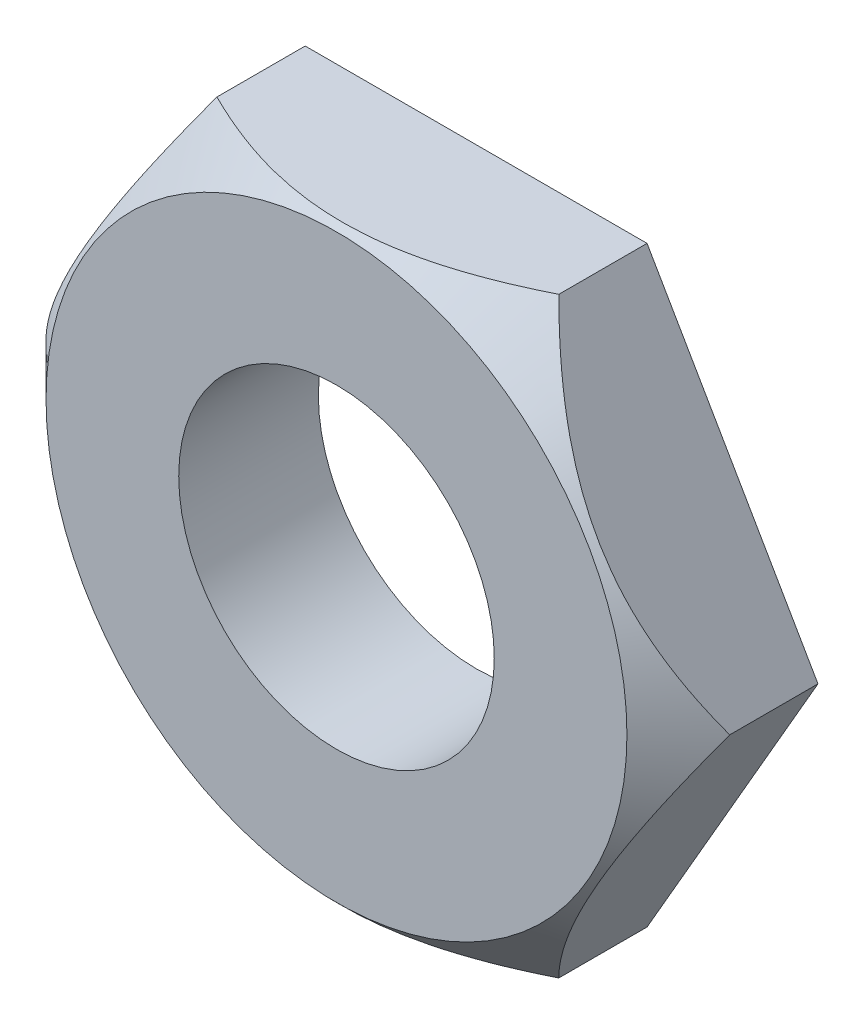
ISO-10303-21;
HEADER;
FILE_DESCRIPTION(('STEP AP214'),'2;1');
FILE_NAME('part.step','',(''),(''),'','','');
FILE_SCHEMA(('AUTOMOTIVE_DESIGN { 1 0 10303 214 1 1 1 1 }'));
ENDSEC;
DATA;
#1=APPLICATION_CONTEXT('core data for automotive mechanical design processes');
#2=APPLICATION_PROTOCOL_DEFINITION('international standard','automotive_design',2000,#1);
#3=PRODUCT_CONTEXT('',#1,'mechanical');
#4=PRODUCT('Part','Part','',(#3));
#5=PRODUCT_RELATED_PRODUCT_CATEGORY('part','',(#4));
#6=PRODUCT_DEFINITION_FORMATION('','',#4);
#7=PRODUCT_DEFINITION_CONTEXT('part definition',#1,'design');
#8=PRODUCT_DEFINITION('design','',#6,#7);
#9=PRODUCT_DEFINITION_SHAPE('','',#8);
#10=(LENGTH_UNIT() NAMED_UNIT(*) SI_UNIT(.MILLI.,.METRE.));
#11=(NAMED_UNIT(*) PLANE_ANGLE_UNIT() SI_UNIT($,.RADIAN.));
#12=(NAMED_UNIT(*) SI_UNIT($,.STERADIAN.) SOLID_ANGLE_UNIT());
#13=UNCERTAINTY_MEASURE_WITH_UNIT(LENGTH_MEASURE(1.E-05),#10,'distance_accuracy_value','');
#14=(GEOMETRIC_REPRESENTATION_CONTEXT(3) GLOBAL_UNCERTAINTY_ASSIGNED_CONTEXT((#13)) GLOBAL_UNIT_ASSIGNED_CONTEXT((#10,
#11,#12)) REPRESENTATION_CONTEXT('',''));
#15=CARTESIAN_POINT('',(0.,0.,0.));
#16=DIRECTION('',(0.,0.,1.));
#17=DIRECTION('',(1.,0.,0.));
#18=AXIS2_PLACEMENT_3D('',#15,#16,#17);
#19=CARTESIAN_POINT('',(-7.77228932383074,13.462,6.35));
#20=DIRECTION('',(0.,0.,-1.));
#21=DIRECTION('',(-1.,0.,0.));
#22=AXIS2_PLACEMENT_3D('',#19,#20,#21);
#23=PLANE('',#22);
#24=CARTESIAN_POINT('',(0.,0.,6.35));
#25=DIRECTION('',(0.,0.,1.));
#26=DIRECTION('',(1.,0.,0.));
#27=AXIS2_PLACEMENT_3D('',#24,#25,#26);
#28=CIRCLE('',#27,7.17423);
#29=CARTESIAN_POINT('',(7.17423,0.,6.35));
#30=VERTEX_POINT('',#29);
#31=EDGE_CURVE('E77',#30,#30,#28,.F.);
#32=ORIENTED_EDGE('',*,*,#31,.T.);
#33=EDGE_LOOP('',(#32));
#34=FACE_BOUND('',#33,.T.);
#35=CARTESIAN_POINT('',(0.,0.,6.34999999999998));
#36=DIRECTION('',(0.,0.,-1.));
#37=DIRECTION('',(-1.,0.,0.));
#38=AXIS2_PLACEMENT_3D('',#35,#36,#37);
#39=CIRCLE('',#38,13.208);
#40=CARTESIAN_POINT('',(-13.208,0.,6.34999999999998));
#41=VERTEX_POINT('',#40);
#42=EDGE_CURVE('E19',#41,#41,#39,.T.);
#43=ORIENTED_EDGE('',*,*,#42,.F.);
#44=EDGE_LOOP('',(#43));
#45=FACE_BOUND('',#44,.T.);
#46=ADVANCED_FACE('F16',(#34,#45),#23,.F.);
#47=CARTESIAN_POINT('',(0.,0.,3.99940188045252));
#48=DIRECTION('',(0.,0.,-1.));
#49=DIRECTION('',(-1.,0.,0.));
#50=AXIS2_PLACEMENT_3D('',#47,#48,#49);
#51=CONICAL_SURFACE('',#50,15.5585981195474,0.785398163397449);
#52=CARTESIAN_POINT('',(7.77228932383077,13.462,4.01342135233847));
#53=CARTESIAN_POINT('',(7.90590812433404,13.2305654486819,4.14701708532263));
#54=CARTESIAN_POINT('',(8.04057335250476,12.9973184314774,4.27653605164236));
#55=CARTESIAN_POINT('',(8.31215952564306,12.5269173809686,4.52612552832875));
#56=CARTESIAN_POINT('',(8.44908165378781,12.2897612983415,4.64619087895492));
#57=CARTESIAN_POINT('',(8.72599022072384,11.8101415913572,4.876086614542));
#58=CARTESIAN_POINT('',(8.8659897150954,11.5676553540717,4.98585446825292));
#59=CARTESIAN_POINT('',(9.14828803327249,11.0787003240977,5.19277128501735));
#60=CARTESIAN_POINT('',(9.29058650181399,10.8322321467446,5.28992217720917));
#61=CARTESIAN_POINT('',(9.57519502855967,10.3392757181538,5.46853139969119));
#62=CARTESIAN_POINT('',(9.71747011698533,10.0928480363492,5.55021134356942));
#63=CARTESIAN_POINT('',(10.0040146064784,9.59653842191835,5.69808514867128));
#64=CARTESIAN_POINT('',(10.1482837910951,9.34665686419564,5.76428067689693));
#65=CARTESIAN_POINT('',(10.4381994312935,8.84450824546305,5.8795192134652));
#66=CARTESIAN_POINT('',(10.5838420159958,8.59224788901308,5.92860082579886));
#67=CARTESIAN_POINT('',(10.8763497950404,8.08560955409868,6.00853309271364));
#68=CARTESIAN_POINT('',(11.0232148033916,7.83123189778038,6.03938647109106));
#69=CARTESIAN_POINT('',(11.3811201888011,7.21132158594865,6.09111971669441));
#70=CARTESIAN_POINT('',(11.592547425901,6.84511886918776,6.10197495908835));
#71=CARTESIAN_POINT('',(12.0150194354329,6.11337588390267,6.0837484129428));
#72=CARTESIAN_POINT('',(12.2260640478502,5.74783589253225,6.05465262611526));
#73=CARTESIAN_POINT('',(12.6461637644256,5.0202018391784,5.95824141710243));
#74=CARTESIAN_POINT('',(12.8552163780591,4.65811209091015,5.89088326353068));
#75=CARTESIAN_POINT('',(13.2697283588107,3.94015627990225,5.72160866026814));
#76=CARTESIAN_POINT('',(13.4751880002315,3.58428974205666,5.61969486091895));
#77=CARTESIAN_POINT('',(13.8398907049855,2.95260612776496,5.41004213758419));
#78=CARTESIAN_POINT('',(13.999941813913,2.67538947529476,5.30782014165736));
#79=CARTESIAN_POINT('',(14.317171366452,2.1259317726348,5.08690578160411));
#80=CARTESIAN_POINT('',(14.4743497232929,1.8536908727362,4.96821292090738));
#81=CARTESIAN_POINT('',(14.7853386753559,1.31504220717053,4.71701688190685));
#82=CARTESIAN_POINT('',(14.9391581147442,1.04861912295814,4.58455713846086));
#83=CARTESIAN_POINT('',(15.2439491495943,0.520705564906258,4.30756581542141));
#84=CARTESIAN_POINT('',(15.3949224217939,0.259212186871657,4.16304163417214));
#85=CARTESIAN_POINT('',(15.5445786476615,0.,4.01342135233847));
#86=B_SPLINE_CURVE_WITH_KNOTS('',3,(#52,#53,#54,#55,#56,#57,#58,#59,#60,#61,#62,#63,#64,#65,#66,
#67,#68,#69,#70,#71,#72,#73,#74,#75,#76,#77,#78,#79,#80,#81,#82,#83,#84,#85),.UNSPECIFIED.,.F.,
.F.,(4,2,2,2,2,2,2,2,2,2,2,2,2,2,2,2,4),(0.,0.896349163338948,1.79318420675432,2.69515369681333,
3.59698511261112,4.48471573633072,5.37235074581777,6.25797035663581,7.14345759818815,
8.41046117827334,9.677908812192,10.9467747215777,12.2155433337597,13.2231542983651,
14.2307956474361,15.2353491852359,16.2392911577559),.UNSPECIFIED.);
#87=CARTESIAN_POINT('',(7.77228932383075,13.462,4.01342135233848));
#88=VERTEX_POINT('',#87);
#89=CARTESIAN_POINT('',(15.5445786476615,0.,4.01342135233847));
#90=VERTEX_POINT('',#89);
#91=EDGE_CURVE('E127',#88,#90,#86,.T.);
#92=ORIENTED_EDGE('',*,*,#91,.F.);
#93=CARTESIAN_POINT('',(-7.77228932383073,13.462,4.01342135233848));
#94=CARTESIAN_POINT('',(-7.50505172282417,13.462,4.14701708532264));
#95=CARTESIAN_POINT('',(-7.23572126648274,13.462,4.27653605164237));
#96=CARTESIAN_POINT('',(-6.69254892020615,13.462,4.52612552832876));
#97=CARTESIAN_POINT('',(-6.41870466391663,13.462,4.64619087895493));
#98=CARTESIAN_POINT('',(-5.86488753004458,13.462,4.87608661454201));
#99=CARTESIAN_POINT('',(-5.58488854130146,13.462,4.98585446825293));
#100=CARTESIAN_POINT('',(-5.02029190494728,13.462,5.19277128501737));
#101=CARTESIAN_POINT('',(-4.73569496786427,13.462,5.28992217720918));
#102=CARTESIAN_POINT('',(-4.16647791437291,13.462,5.4685313996912));
#103=CARTESIAN_POINT('',(-3.88192773752159,13.462,5.55021134356943));
#104=CARTESIAN_POINT('',(-3.30883875853554,13.462,5.69808514867129));
#105=CARTESIAN_POINT('',(-3.02030038930208,13.462,5.76428067689694));
#106=CARTESIAN_POINT('',(-2.44046910890517,13.462,5.87951921346521));
#107=CARTESIAN_POINT('',(-2.14918393950064,13.462,5.92860082579887));
#108=CARTESIAN_POINT('',(-1.56416838141141,13.462,6.00853309271365));
#109=CARTESIAN_POINT('',(-1.27043836470902,13.462,6.03938647109108));
#110=CARTESIAN_POINT('',(-0.55462759389007,13.462,6.09111971669442));
#111=CARTESIAN_POINT('',(-0.131773119690327,13.462,6.10197495908836));
#112=CARTESIAN_POINT('',(0.713170899373601,13.462,6.08374841294282));
#113=CARTESIAN_POINT('',(1.13526012420818,13.462,6.05465262611527));
#114=CARTESIAN_POINT('',(1.97545955735894,13.462,5.95824141710244));
#115=CARTESIAN_POINT('',(2.3935647846259,13.462,5.8908832635307));
#116=CARTESIAN_POINT('',(3.22258874612923,13.462,5.72160866026815));
#117=CARTESIAN_POINT('',(3.63350802897069,13.462,5.61969486091896));
#118=CARTESIAN_POINT('',(4.36291343847867,13.462,5.4100421375842));
#119=CARTESIAN_POINT('',(4.68301565633371,13.462,5.30782014165738));
#120=CARTESIAN_POINT('',(5.31747476141178,13.462,5.08690578160412));
#121=CARTESIAN_POINT('',(5.63183147509355,13.462,4.96821292090739));
#122=CARTESIAN_POINT('',(6.2538093792195,13.462,4.71701688190686));
#123=CARTESIAN_POINT('',(6.56144825799621,13.462,4.58455713846087));
#124=CARTESIAN_POINT('',(7.17103032769642,13.462,4.30756581542142));
#125=CARTESIAN_POINT('',(7.47297687209559,13.462,4.16304163417215));
#126=CARTESIAN_POINT('',(7.77228932383073,13.462,4.01342135233848));
#127=B_SPLINE_CURVE_WITH_KNOTS('',3,(#93,#94,#95,#96,#97,#98,#99,#100,#101,#102,#103,#104,#105,
#106,#107,#108,#109,#110,#111,#112,#113,#114,#115,#116,#117,#118,#119,#120,#121,#122,#123,#124,
#125,#126),.UNSPECIFIED.,.F.,.F.,(4,2,2,2,2,2,2,2,2,2,2,2,2,2,2,2,4),(0.,0.89634916333895,
1.79318420675432,2.69515369681333,3.59698511261112,4.48471573633073,5.37235074581777,
6.25797035663582,7.14345759818816,8.41046117827334,9.67790881219201,10.9467747215777,
12.2155433337597,13.2231542983651,14.2307956474361,15.2353491852359,16.2392911577559),.UNSPECIFIED.);
#128=CARTESIAN_POINT('',(-7.77228932383075,13.462,4.01342135233848));
#129=VERTEX_POINT('',#128);
#130=EDGE_CURVE('E74',#129,#88,#127,.T.);
#131=ORIENTED_EDGE('',*,*,#130,.F.);
#132=CARTESIAN_POINT('',(-15.5445786476615,0.,4.01342135233848));
#133=CARTESIAN_POINT('',(-15.4109598471582,0.231434551318111,4.14701708532263));
#134=CARTESIAN_POINT('',(-15.2762946189875,0.464681568522647,4.27653605164237));
#135=CARTESIAN_POINT('',(-15.0047084458492,0.935082619031376,4.52612552832875));
#136=CARTESIAN_POINT('',(-14.8677863177044,1.17223870165855,4.64619087895492));
#137=CARTESIAN_POINT('',(-14.5908777507684,1.65185840864283,4.876086614542));
#138=CARTESIAN_POINT('',(-14.4508782563969,1.89434464592833,4.98585446825292));
#139=CARTESIAN_POINT('',(-14.1685799382198,2.3832996759023,5.19277128501736));
#140=CARTESIAN_POINT('',(-14.0262814696783,2.62976785325542,5.28992217720917));
#141=CARTESIAN_POINT('',(-13.7416729429326,3.12272428184626,5.46853139969118));
#142=CARTESIAN_POINT('',(-13.5993978545069,3.36915196365086,5.55021134356942));
#143=CARTESIAN_POINT('',(-13.3128533650139,3.86546157808166,5.69808514867128));
#144=CARTESIAN_POINT('',(-13.1685841803972,4.11534313580437,5.76428067689693));
#145=CARTESIAN_POINT('',(-12.8786685401987,4.61749175453696,5.87951921346519));
#146=CARTESIAN_POINT('',(-12.7330259554964,4.86975211098693,5.92860082579886));
#147=CARTESIAN_POINT('',(-12.4405181764518,5.37639044590133,6.00853309271364));
#148=CARTESIAN_POINT('',(-12.2936531681006,5.63076810221963,6.03938647109106));
#149=CARTESIAN_POINT('',(-11.9357477826912,6.25067841405136,6.09111971669441));
#150=CARTESIAN_POINT('',(-11.7243205455913,6.61688113081225,6.10197495908835));
#151=CARTESIAN_POINT('',(-11.3018485360593,7.34862411609734,6.0837484129428));
#152=CARTESIAN_POINT('',(-11.090803923642,7.71416410746776,6.05465262611526));
#153=CARTESIAN_POINT('',(-10.6707042070667,8.44179816082161,5.95824141710242));
#154=CARTESIAN_POINT('',(-10.4616515934332,8.80388790908986,5.89088326353068));
#155=CARTESIAN_POINT('',(-10.0471396126815,9.52184372009776,5.72160866026814));
#156=CARTESIAN_POINT('',(-9.84167997126078,9.87771025794335,5.61969486091895));
#157=CARTESIAN_POINT('',(-9.4769772665068,10.509393872235,5.41004213758418));
#158=CARTESIAN_POINT('',(-9.31692615757928,10.7866105247052,5.30782014165737));
#159=CARTESIAN_POINT('',(-8.99969660504024,11.3360682273652,5.08690578160411));
#160=CARTESIAN_POINT('',(-8.84251824819936,11.6083091272638,4.96821292090738));
#161=CARTESIAN_POINT('',(-8.53152929613638,12.1469577928295,4.71701688190685));
#162=CARTESIAN_POINT('',(-8.37770985674803,12.4133808770419,4.58455713846086));
#163=CARTESIAN_POINT('',(-8.07291882189792,12.9412944350937,4.30756581542141));
#164=CARTESIAN_POINT('',(-7.92194554969834,13.2027878131283,4.16304163417214));
#165=CARTESIAN_POINT('',(-7.77228932383077,13.462,4.01342135233847));
#166=B_SPLINE_CURVE_WITH_KNOTS('',3,(#132,#133,#134,#135,#136,#137,#138,#139,#140,#141,#142,
#143,#144,#145,#146,#147,#148,#149,#150,#151,#152,#153,#154,#155,#156,#157,#158,#159,#160,#161,
#162,#163,#164,#165),.UNSPECIFIED.,.F.,.F.,(4,2,2,2,2,2,2,2,2,2,2,2,2,2,2,2,4),(0.,
0.896349163338949,1.79318420675432,2.69515369681333,3.59698511261112,4.48471573633072,
5.37235074581776,6.2579703566358,7.14345759818814,8.41046117827333,9.677908812192,
10.9467747215777,12.2155433337597,13.2231542983651,14.2307956474361,15.2353491852359,
16.2392911577559),.UNSPECIFIED.);
#167=CARTESIAN_POINT('',(-15.5445786476615,0.,4.01342135233848));
#168=VERTEX_POINT('',#167);
#169=EDGE_CURVE('E67',#168,#129,#166,.T.);
#170=ORIENTED_EDGE('',*,*,#169,.F.);
#171=CARTESIAN_POINT('',(-7.77228932383075,-13.462,4.01342135233848));
#172=CARTESIAN_POINT('',(-7.90590812433402,-13.2305654486819,4.14701708532264));
#173=CARTESIAN_POINT('',(-8.04057335250474,-12.9973184314774,4.27653605164238));
#174=CARTESIAN_POINT('',(-8.31215952564304,-12.5269173809686,4.52612552832876));
#175=CARTESIAN_POINT('',(-8.4490816537878,-12.2897612983415,4.64619087895493));
#176=CARTESIAN_POINT('',(-8.72599022072382,-11.8101415913572,4.87608661454201));
#177=CARTESIAN_POINT('',(-8.86598971509538,-11.5676553540717,4.98585446825293));
#178=CARTESIAN_POINT('',(-9.14828803327247,-11.0787003240977,5.19277128501737));
#179=CARTESIAN_POINT('',(-9.29058650181397,-10.8322321467446,5.28992217720918));
#180=CARTESIAN_POINT('',(-9.57519502855966,-10.3392757181537,5.4685313996912));
#181=CARTESIAN_POINT('',(-9.71747011698532,-10.0928480363491,5.55021134356943));
#182=CARTESIAN_POINT('',(-10.0040146064783,-9.59653842191834,5.69808514867129));
#183=CARTESIAN_POINT('',(-10.1482837910951,-9.34665686419563,5.76428067689694));
#184=CARTESIAN_POINT('',(-10.4381994312935,-8.84450824546304,5.87951921346521));
#185=CARTESIAN_POINT('',(-10.5838420159958,-8.59224788901307,5.92860082579888));
#186=CARTESIAN_POINT('',(-10.8763497950404,-8.08560955409867,6.00853309271366));
#187=CARTESIAN_POINT('',(-11.0232148033916,-7.83123189778037,6.03938647109108));
#188=CARTESIAN_POINT('',(-11.3811201888011,-7.21132158594863,6.09111971669443));
#189=CARTESIAN_POINT('',(-11.5925474259009,-6.84511886918775,6.10197495908836));
#190=CARTESIAN_POINT('',(-12.0150194354329,-6.11337588390266,6.08374841294282));
#191=CARTESIAN_POINT('',(-12.2260640478502,-5.74783589253224,6.05465262611527));
#192=CARTESIAN_POINT('',(-12.6461637644256,-5.02020183917839,5.95824141710244));
#193=CARTESIAN_POINT('',(-12.8552163780591,-4.65811209091014,5.8908832635307));
#194=CARTESIAN_POINT('',(-13.2697283588107,-3.94015627990224,5.72160866026815));
#195=CARTESIAN_POINT('',(-13.4751880002315,-3.58428974205665,5.61969486091896));
#196=CARTESIAN_POINT('',(-13.8398907049854,-2.95260612776495,5.4100421375842));
#197=CARTESIAN_POINT('',(-13.999941813913,-2.67538947529475,5.30782014165738));
#198=CARTESIAN_POINT('',(-14.317171366452,-2.12593177263479,5.08690578160413));
#199=CARTESIAN_POINT('',(-14.4743497232929,-1.85369087273619,4.9682129209074));
#200=CARTESIAN_POINT('',(-14.7853386753559,-1.31504220717052,4.71701688190686));
#201=CARTESIAN_POINT('',(-14.9391581147442,-1.04861912295813,4.58455713846087));
#202=CARTESIAN_POINT('',(-15.2439491495943,-0.520705564906248,4.30756581542142));
#203=CARTESIAN_POINT('',(-15.3949224217939,-0.259212186871646,4.16304163417216));
#204=CARTESIAN_POINT('',(-15.5445786476615,0.,4.01342135233849));
#205=B_SPLINE_CURVE_WITH_KNOTS('',3,(#171,#172,#173,#174,#175,#176,#177,#178,#179,#180,#181,
#182,#183,#184,#185,#186,#187,#188,#189,#190,#191,#192,#193,#194,#195,#196,#197,#198,#199,#200,
#201,#202,#203,#204),.UNSPECIFIED.,.F.,.F.,(4,2,2,2,2,2,2,2,2,2,2,2,2,2,2,2,4),(0.,
0.896349163338952,1.79318420675432,2.69515369681334,3.59698511261113,4.48471573633074,
5.37235074581778,6.25797035663582,7.14345759818816,8.41046117827335,9.67790881219202,
10.9467747215777,12.2155433337597,13.2231542983651,14.2307956474361,15.2353491852359,
16.2392911577559),.UNSPECIFIED.);
#206=CARTESIAN_POINT('',(-7.77228932383073,-13.462,4.01342135233849));
#207=VERTEX_POINT('',#206);
#208=EDGE_CURVE('E72',#207,#168,#205,.T.);
#209=ORIENTED_EDGE('',*,*,#208,.F.);
#210=CARTESIAN_POINT('',(7.77228932383073,-13.462,4.01342135233848));
#211=CARTESIAN_POINT('',(7.50505172282418,-13.462,4.14701708532263));
#212=CARTESIAN_POINT('',(7.23572126648274,-13.462,4.27653605164237));
#213=CARTESIAN_POINT('',(6.69254892020615,-13.462,4.52612552832876));
#214=CARTESIAN_POINT('',(6.41870466391663,-13.462,4.64619087895493));
#215=CARTESIAN_POINT('',(5.86488753004458,-13.462,4.87608661454201));
#216=CARTESIAN_POINT('',(5.58488854130146,-13.462,4.98585446825293));
#217=CARTESIAN_POINT('',(5.02029190494728,-13.462,5.19277128501737));
#218=CARTESIAN_POINT('',(4.73569496786428,-13.462,5.28992217720918));
#219=CARTESIAN_POINT('',(4.16647791437291,-13.462,5.4685313996912));
#220=CARTESIAN_POINT('',(3.88192773752159,-13.462,5.55021134356943));
#221=CARTESIAN_POINT('',(3.30883875853554,-13.462,5.69808514867129));
#222=CARTESIAN_POINT('',(3.02030038930208,-13.462,5.76428067689694));
#223=CARTESIAN_POINT('',(2.44046910890517,-13.462,5.87951921346521));
#224=CARTESIAN_POINT('',(2.14918393950064,-13.462,5.92860082579887));
#225=CARTESIAN_POINT('',(1.56416838141141,-13.462,6.00853309271365));
#226=CARTESIAN_POINT('',(1.27043836470903,-13.462,6.03938647109108));
#227=CARTESIAN_POINT('',(0.554627593890073,-13.462,6.09111971669442));
#228=CARTESIAN_POINT('',(0.131773119690331,-13.462,6.10197495908836));
#229=CARTESIAN_POINT('',(-0.713170899373597,-13.462,6.08374841294282));
#230=CARTESIAN_POINT('',(-1.13526012420817,-13.462,6.05465262611527));
#231=CARTESIAN_POINT('',(-1.97545955735893,-13.462,5.95824141710244));
#232=CARTESIAN_POINT('',(-2.39356478462589,-13.462,5.8908832635307));
#233=CARTESIAN_POINT('',(-3.22258874612923,-13.462,5.72160866026815));
#234=CARTESIAN_POINT('',(-3.63350802897068,-13.462,5.61969486091896));
#235=CARTESIAN_POINT('',(-4.36291343847866,-13.462,5.4100421375842));
#236=CARTESIAN_POINT('',(-4.6830156563337,-13.462,5.30782014165738));
#237=CARTESIAN_POINT('',(-5.31747476141178,-13.462,5.08690578160413));
#238=CARTESIAN_POINT('',(-5.63183147509354,-13.462,4.9682129209074));
#239=CARTESIAN_POINT('',(-6.25380937921949,-13.462,4.71701688190686));
#240=CARTESIAN_POINT('',(-6.5614482579962,-13.462,4.58455713846087));
#241=CARTESIAN_POINT('',(-7.17103032769641,-13.462,4.30756581542143));
#242=CARTESIAN_POINT('',(-7.47297687209557,-13.462,4.16304163417216));
#243=CARTESIAN_POINT('',(-7.77228932383072,-13.462,4.01342135233849));
#244=B_SPLINE_CURVE_WITH_KNOTS('',3,(#210,#211,#212,#213,#214,#215,#216,#217,#218,#219,#220,
#221,#222,#223,#224,#225,#226,#227,#228,#229,#230,#231,#232,#233,#234,#235,#236,#237,#238,#239,
#240,#241,#242,#243),.UNSPECIFIED.,.F.,.F.,(4,2,2,2,2,2,2,2,2,2,2,2,2,2,2,2,4),(0.,
0.896349163338951,1.79318420675432,2.69515369681334,3.59698511261113,4.48471573633073,
5.37235074581777,6.25797035663582,7.14345759818816,8.41046117827334,9.67790881219201,
10.9467747215777,12.2155433337597,13.2231542983651,14.2307956474361,15.2353491852359,
16.2392911577559),.UNSPECIFIED.);
#245=CARTESIAN_POINT('',(7.77228932383075,-13.462,4.01342135233848));
#246=VERTEX_POINT('',#245);
#247=EDGE_CURVE('E90',#246,#207,#244,.T.);
#248=ORIENTED_EDGE('',*,*,#247,.F.);
#249=CARTESIAN_POINT('',(15.5445786476615,0.,4.01342135233847));
#250=CARTESIAN_POINT('',(15.4109598471582,-0.231434551318106,4.14701708532262));
#251=CARTESIAN_POINT('',(15.2762946189875,-0.464681568522642,4.27653605164236));
#252=CARTESIAN_POINT('',(15.0047084458492,-0.935082619031372,4.52612552832874));
#253=CARTESIAN_POINT('',(14.8677863177044,-1.17223870165855,4.64619087895491));
#254=CARTESIAN_POINT('',(14.5908777507684,-1.65185840864283,4.87608661454199));
#255=CARTESIAN_POINT('',(14.4508782563969,-1.89434464592833,4.98585446825292));
#256=CARTESIAN_POINT('',(14.1685799382198,-2.38329967590229,5.19277128501735));
#257=CARTESIAN_POINT('',(14.0262814696783,-2.62976785325541,5.28992217720916));
#258=CARTESIAN_POINT('',(13.7416729429326,-3.12272428184626,5.46853139969118));
#259=CARTESIAN_POINT('',(13.5993978545069,-3.36915196365085,5.55021134356941));
#260=CARTESIAN_POINT('',(13.3128533650139,-3.86546157808166,5.69808514867127));
#261=CARTESIAN_POINT('',(13.1685841803972,-4.11534313580437,5.76428067689692));
#262=CARTESIAN_POINT('',(12.8786685401987,-4.61749175453696,5.87951921346519));
#263=CARTESIAN_POINT('',(12.7330259554965,-4.86975211098693,5.92860082579885));
#264=CARTESIAN_POINT('',(12.4405181764518,-5.37639044590133,6.00853309271363));
#265=CARTESIAN_POINT('',(12.2936531681006,-5.63076810221963,6.03938647109106));
#266=CARTESIAN_POINT('',(11.9357477826912,-6.25067841405136,6.09111971669441));
#267=CARTESIAN_POINT('',(11.7243205455913,-6.61688113081225,6.10197495908834));
#268=CARTESIAN_POINT('',(11.3018485360593,-7.34862411609734,6.0837484129428));
#269=CARTESIAN_POINT('',(11.090803923642,-7.71416410746777,6.05465262611525));
#270=CARTESIAN_POINT('',(10.6707042070667,-8.44179816082161,5.95824141710242));
#271=CARTESIAN_POINT('',(10.4616515934332,-8.80388790908986,5.89088326353068));
#272=CARTESIAN_POINT('',(10.0471396126815,-9.52184372009777,5.72160866026813));
#273=CARTESIAN_POINT('',(9.84167997126078,-9.87771025794335,5.61969486091894));
#274=CARTESIAN_POINT('',(9.4769772665068,-10.509393872235,5.41004213758418));
#275=CARTESIAN_POINT('',(9.31692615757928,-10.7866105247053,5.30782014165736));
#276=CARTESIAN_POINT('',(8.99969660504024,-11.3360682273652,5.08690578160411));
#277=CARTESIAN_POINT('',(8.84251824819936,-11.6083091272638,4.96821292090738));
#278=CARTESIAN_POINT('',(8.53152929613638,-12.1469577928295,4.71701688190684));
#279=CARTESIAN_POINT('',(8.37770985674803,-12.4133808770419,4.58455713846085));
#280=CARTESIAN_POINT('',(8.07291882189792,-12.9412944350938,4.30756581542141));
#281=CARTESIAN_POINT('',(7.92194554969834,-13.2027878131284,4.16304163417214));
#282=CARTESIAN_POINT('',(7.77228932383077,-13.462,4.01342135233847));
#283=B_SPLINE_CURVE_WITH_KNOTS('',3,(#249,#250,#251,#252,#253,#254,#255,#256,#257,#258,#259,
#260,#261,#262,#263,#264,#265,#266,#267,#268,#269,#270,#271,#272,#273,#274,#275,#276,#277,#278,
#279,#280,#281,#282),.UNSPECIFIED.,.F.,.F.,(4,2,2,2,2,2,2,2,2,2,2,2,2,2,2,2,4),(0.,
0.89634916333895,1.79318420675432,2.69515369681333,3.59698511261112,4.48471573633073,
5.37235074581777,6.25797035663581,7.14345759818815,8.41046117827334,9.67790881219201,
10.9467747215777,12.2155433337597,13.2231542983651,14.2307956474361,15.2353491852359,
16.2392911577559),.UNSPECIFIED.);
#284=EDGE_CURVE('E121',#90,#246,#283,.T.);
#285=ORIENTED_EDGE('',*,*,#284,.F.);
#286=EDGE_LOOP('',(#92,#131,#170,#209,#248,#285));
#287=FACE_BOUND('',#286,.T.);
#288=ORIENTED_EDGE('',*,*,#42,.T.);
#289=EDGE_LOOP('',(#288));
#290=FACE_BOUND('',#289,.T.);
#291=ADVANCED_FACE('F69',(#287,#290),#51,.T.);
#292=CARTESIAN_POINT('',(0.,0.,6.35));
#293=DIRECTION('',(0.,0.,1.));
#294=DIRECTION('',(1.,0.,0.));
#295=AXIS2_PLACEMENT_3D('',#292,#293,#294);
#296=CYLINDRICAL_SURFACE('',#295,7.17423);
#297=ORIENTED_EDGE('',*,*,#31,.F.);
#298=EDGE_LOOP('',(#297));
#299=FACE_BOUND('',#298,.T.);
#300=CARTESIAN_POINT('',(0.,0.,0.));
#301=DIRECTION('',(0.,0.,1.));
#302=DIRECTION('',(1.,0.,0.));
#303=AXIS2_PLACEMENT_3D('',#300,#301,#302);
#304=CIRCLE('',#303,7.17423);
#305=CARTESIAN_POINT('',(7.17423,0.,0.));
#306=VERTEX_POINT('',#305);
#307=EDGE_CURVE('E98',#306,#306,#304,.T.);
#308=ORIENTED_EDGE('',*,*,#307,.F.);
#309=EDGE_LOOP('',(#308));
#310=FACE_BOUND('',#309,.T.);
#311=ADVANCED_FACE('F110',(#299,#310),#296,.F.);
#312=CARTESIAN_POINT('',(-15.5445786476615,0.,6.35));
#313=DIRECTION('',(-0.866025403784439,0.5,0.));
#314=DIRECTION('',(-0.5,-0.866025403784439,0.));
#315=AXIS2_PLACEMENT_3D('',#312,#313,#314);
#316=PLANE('',#315);
#317=DIRECTION('',(0.500000000000001,0.866025403784438,0.));
#318=VECTOR('',#317,1.);
#319=CARTESIAN_POINT('',(-15.5445786476615,0.,0.));
#320=LINE('',#319,#318);
#321=CARTESIAN_POINT('',(-15.5445786476615,0.,0.));
#322=VERTEX_POINT('',#321);
#323=CARTESIAN_POINT('',(-7.77228932383074,13.462,0.));
#324=VERTEX_POINT('',#323);
#325=EDGE_CURVE('E83',#322,#324,#320,.T.);
#326=ORIENTED_EDGE('',*,*,#325,.F.);
#327=DIRECTION('',(0.,0.,1.));
#328=VECTOR('',#327,1.);
#329=CARTESIAN_POINT('',(-15.5445786476615,0.,6.35));
#330=LINE('',#329,#328);
#331=EDGE_CURVE('E80',#168,#322,#330,.F.);
#332=ORIENTED_EDGE('',*,*,#331,.F.);
#333=ORIENTED_EDGE('',*,*,#169,.T.);
#334=DIRECTION('',(0.,0.,1.));
#335=VECTOR('',#334,1.);
#336=CARTESIAN_POINT('',(-7.77228932383074,13.462,6.35));
#337=LINE('',#336,#335);
#338=EDGE_CURVE('E134',#324,#129,#337,.T.);
#339=ORIENTED_EDGE('',*,*,#338,.F.);
#340=EDGE_LOOP('',(#326,#332,#333,#339));
#341=FACE_BOUND('',#340,.T.);
#342=ADVANCED_FACE('F81',(#341),#316,.T.);
#343=CARTESIAN_POINT('',(-7.77228932383074,13.462,6.35));
#344=DIRECTION('',(0.,1.,0.));
#345=DIRECTION('',(0.,0.,1.));
#346=AXIS2_PLACEMENT_3D('',#343,#344,#345);
#347=PLANE('',#346);
#348=DIRECTION('',(-1.,0.,0.));
#349=VECTOR('',#348,1.);
#350=CARTESIAN_POINT('',(-7.77228932383074,13.462,0.));
#351=LINE('',#350,#349);
#352=CARTESIAN_POINT('',(7.77228932383075,13.462,0.));
#353=VERTEX_POINT('',#352);
#354=EDGE_CURVE('E169',#324,#353,#351,.F.);
#355=ORIENTED_EDGE('',*,*,#354,.F.);
#356=ORIENTED_EDGE('',*,*,#338,.T.);
#357=ORIENTED_EDGE('',*,*,#130,.T.);
#358=DIRECTION('',(0.,0.,1.));
#359=VECTOR('',#358,1.);
#360=CARTESIAN_POINT('',(7.77228932383075,13.462,6.35));
#361=LINE('',#360,#359);
#362=EDGE_CURVE('E133',#353,#88,#361,.T.);
#363=ORIENTED_EDGE('',*,*,#362,.F.);
#364=EDGE_LOOP('',(#355,#356,#357,#363));
#365=FACE_BOUND('',#364,.T.);
#366=ADVANCED_FACE('F143',(#365),#347,.T.);
#367=CARTESIAN_POINT('',(15.5445786476615,0.,6.35));
#368=DIRECTION('',(0.866025403784439,0.5,0.));
#369=DIRECTION('',(-0.5,0.866025403784439,0.));
#370=AXIS2_PLACEMENT_3D('',#367,#368,#369);
#371=PLANE('',#370);
#372=DIRECTION('',(0.500000000000001,-0.866025403784438,0.));
#373=VECTOR('',#372,1.);
#374=CARTESIAN_POINT('',(7.77228932383074,13.462,0.));
#375=LINE('',#374,#373);
#376=CARTESIAN_POINT('',(15.5445786476615,0.,0.));
#377=VERTEX_POINT('',#376);
#378=EDGE_CURVE('E200',#353,#377,#375,.T.);
#379=ORIENTED_EDGE('',*,*,#378,.F.);
#380=ORIENTED_EDGE('',*,*,#362,.T.);
#381=ORIENTED_EDGE('',*,*,#91,.T.);
#382=DIRECTION('',(0.,0.,1.));
#383=VECTOR('',#382,1.);
#384=CARTESIAN_POINT('',(15.5445786476615,0.,6.35));
#385=LINE('',#384,#383);
#386=EDGE_CURVE('E179',#377,#90,#385,.T.);
#387=ORIENTED_EDGE('',*,*,#386,.F.);
#388=EDGE_LOOP('',(#379,#380,#381,#387));
#389=FACE_BOUND('',#388,.T.);
#390=ADVANCED_FACE('F139',(#389),#371,.T.);
#391=CARTESIAN_POINT('',(15.5445786476615,0.,6.35));
#392=DIRECTION('',(0.866025403784439,-0.5,0.));
#393=DIRECTION('',(0.5,0.866025403784439,0.));
#394=AXIS2_PLACEMENT_3D('',#391,#392,#393);
#395=PLANE('',#394);
#396=DIRECTION('',(-0.5,-0.866025403784438,0.));
#397=VECTOR('',#396,1.);
#398=CARTESIAN_POINT('',(15.5445786476615,0.,0.));
#399=LINE('',#398,#397);
#400=CARTESIAN_POINT('',(7.77228932383075,-13.462,0.));
#401=VERTEX_POINT('',#400);
#402=EDGE_CURVE('E194',#377,#401,#399,.T.);
#403=ORIENTED_EDGE('',*,*,#402,.F.);
#404=ORIENTED_EDGE('',*,*,#386,.T.);
#405=ORIENTED_EDGE('',*,*,#284,.T.);
#406=DIRECTION('',(0.,0.,-1.));
#407=VECTOR('',#406,1.);
#408=CARTESIAN_POINT('',(7.77228932383075,-13.462,6.35));
#409=LINE('',#408,#407);
#410=EDGE_CURVE('E87',#401,#246,#409,.F.);
#411=ORIENTED_EDGE('',*,*,#410,.F.);
#412=EDGE_LOOP('',(#403,#404,#405,#411));
#413=FACE_BOUND('',#412,.T.);
#414=ADVANCED_FACE('F142',(#413),#395,.T.);
#415=CARTESIAN_POINT('',(7.77228932383075,-13.462,6.35));
#416=DIRECTION('',(0.,-1.,0.));
#417=DIRECTION('',(0.,0.,-1.));
#418=AXIS2_PLACEMENT_3D('',#415,#416,#417);
#419=PLANE('',#418);
#420=DIRECTION('',(-1.,0.,0.));
#421=VECTOR('',#420,1.);
#422=CARTESIAN_POINT('',(-7.77228932383074,-13.462,0.));
#423=LINE('',#422,#421);
#424=CARTESIAN_POINT('',(-7.77228932383074,-13.462,0.));
#425=VERTEX_POINT('',#424);
#426=EDGE_CURVE('E25',#401,#425,#423,.T.);
#427=ORIENTED_EDGE('',*,*,#426,.F.);
#428=ORIENTED_EDGE('',*,*,#410,.T.);
#429=ORIENTED_EDGE('',*,*,#247,.T.);
#430=DIRECTION('',(0.,0.,1.));
#431=VECTOR('',#430,1.);
#432=CARTESIAN_POINT('',(-7.77228932383074,-13.462,6.35));
#433=LINE('',#432,#431);
#434=EDGE_CURVE('E34',#425,#207,#433,.T.);
#435=ORIENTED_EDGE('',*,*,#434,.F.);
#436=EDGE_LOOP('',(#427,#428,#429,#435));
#437=FACE_BOUND('',#436,.T.);
#438=ADVANCED_FACE('F162',(#437),#419,.T.);
#439=CARTESIAN_POINT('',(-7.77228932383074,-13.462,6.35));
#440=DIRECTION('',(-0.866025403784439,-0.5,0.));
#441=DIRECTION('',(0.5,-0.866025403784439,0.));
#442=AXIS2_PLACEMENT_3D('',#439,#440,#441);
#443=PLANE('',#442);
#444=DIRECTION('',(-0.500000000000001,0.866025403784438,0.));
#445=VECTOR('',#444,1.);
#446=CARTESIAN_POINT('',(-7.77228932383074,-13.462,0.));
#447=LINE('',#446,#445);
#448=EDGE_CURVE('E11',#425,#322,#447,.T.);
#449=ORIENTED_EDGE('',*,*,#448,.F.);
#450=ORIENTED_EDGE('',*,*,#434,.T.);
#451=ORIENTED_EDGE('',*,*,#208,.T.);
#452=ORIENTED_EDGE('',*,*,#331,.T.);
#453=EDGE_LOOP('',(#449,#450,#451,#452));
#454=FACE_BOUND('',#453,.T.);
#455=ADVANCED_FACE('F86',(#454),#443,.T.);
#456=CARTESIAN_POINT('',(-7.77228932383074,13.462,0.));
#457=DIRECTION('',(0.,0.,-1.));
#458=DIRECTION('',(-1.,0.,0.));
#459=AXIS2_PLACEMENT_3D('',#456,#457,#458);
#460=PLANE('',#459);
#461=ORIENTED_EDGE('',*,*,#426,.T.);
#462=ORIENTED_EDGE('',*,*,#448,.T.);
#463=ORIENTED_EDGE('',*,*,#325,.T.);
#464=ORIENTED_EDGE('',*,*,#354,.T.);
#465=ORIENTED_EDGE('',*,*,#378,.T.);
#466=ORIENTED_EDGE('',*,*,#402,.T.);
#467=EDGE_LOOP('',(#461,#462,#463,#464,#465,#466));
#468=FACE_BOUND('',#467,.T.);
#469=ORIENTED_EDGE('',*,*,#307,.T.);
#470=EDGE_LOOP('',(#469));
#471=FACE_BOUND('',#470,.T.);
#472=ADVANCED_FACE('F156',(#468,#471),#460,.T.);
#473=CLOSED_SHELL('',(#46,#291,#311,#342,#366,#390,#414,#438,#455,#472));
#474=MANIFOLD_SOLID_BREP('B1',#473);
#475=ADVANCED_BREP_SHAPE_REPRESENTATION('',(#18,#474),#14);
#476=SHAPE_DEFINITION_REPRESENTATION(#9,#475);
ENDSEC;
END-ISO-10303-21;
